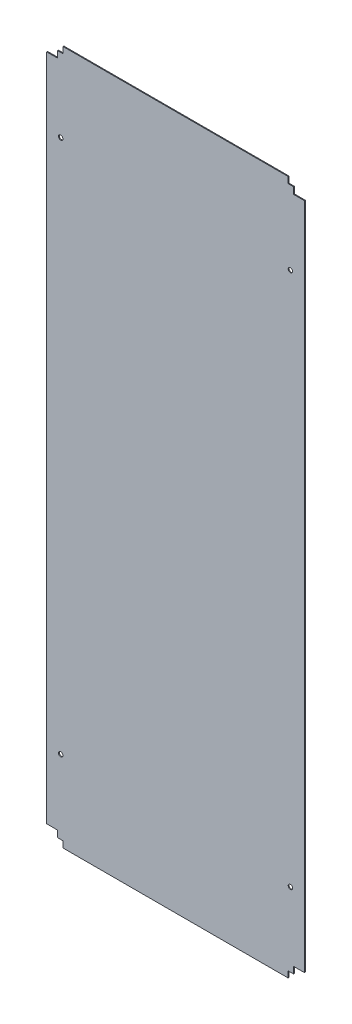
ISO-10303-21;
HEADER;
FILE_DESCRIPTION(('STEP AP214'),'2;1');
FILE_NAME('part.step','',(''),(''),'','','');
FILE_SCHEMA(('AUTOMOTIVE_DESIGN { 1 0 10303 214 1 1 1 1 }'));
ENDSEC;
DATA;
#1=APPLICATION_CONTEXT('core data for automotive mechanical design processes');
#2=APPLICATION_PROTOCOL_DEFINITION('international standard','automotive_design',2000,#1);
#3=PRODUCT_CONTEXT('',#1,'mechanical');
#4=PRODUCT('Part','Part','',(#3));
#5=PRODUCT_RELATED_PRODUCT_CATEGORY('part','',(#4));
#6=PRODUCT_DEFINITION_FORMATION('','',#4);
#7=PRODUCT_DEFINITION_CONTEXT('part definition',#1,'design');
#8=PRODUCT_DEFINITION('design','',#6,#7);
#9=PRODUCT_DEFINITION_SHAPE('','',#8);
#10=(LENGTH_UNIT() NAMED_UNIT(*) SI_UNIT(.MILLI.,.METRE.));
#11=(NAMED_UNIT(*) PLANE_ANGLE_UNIT() SI_UNIT($,.RADIAN.));
#12=(NAMED_UNIT(*) SI_UNIT($,.STERADIAN.) SOLID_ANGLE_UNIT());
#13=UNCERTAINTY_MEASURE_WITH_UNIT(LENGTH_MEASURE(1.E-05),#10,'distance_accuracy_value','');
#14=(GEOMETRIC_REPRESENTATION_CONTEXT(3) GLOBAL_UNCERTAINTY_ASSIGNED_CONTEXT((#13)) GLOBAL_UNIT_ASSIGNED_CONTEXT((#10,
#11,#12)) REPRESENTATION_CONTEXT('',''));
#15=CARTESIAN_POINT('',(0.,0.,0.));
#16=DIRECTION('',(0.,0.,1.));
#17=DIRECTION('',(1.,0.,0.));
#18=AXIS2_PLACEMENT_3D('',#15,#16,#17);
#19=CARTESIAN_POINT('',(0.,0.,-1.524));
#20=DIRECTION('',(0.,0.,1.));
#21=DIRECTION('',(1.,0.,0.));
#22=AXIS2_PLACEMENT_3D('',#19,#20,#21);
#23=PLANE('',#22);
#24=CARTESIAN_POINT('',(-204.851,476.25,-1.524));
#25=DIRECTION('',(0.,0.,1.));
#26=DIRECTION('',(1.,0.,0.));
#27=AXIS2_PLACEMENT_3D('',#24,#25,#26);
#28=CIRCLE('',#27,3.9624);
#29=CARTESIAN_POINT('',(-200.8886,476.25,-1.524));
#30=VERTEX_POINT('',#29);
#31=EDGE_CURVE('E534',#30,#30,#28,.T.);
#32=ORIENTED_EDGE('',*,*,#31,.T.);
#33=EDGE_LOOP('',(#32));
#34=FACE_BOUND('',#33,.T.);
#35=CARTESIAN_POINT('',(-204.851,-476.25,-1.524));
#36=DIRECTION('',(0.,0.,1.));
#37=DIRECTION('',(1.,0.,0.));
#38=AXIS2_PLACEMENT_3D('',#35,#36,#37);
#39=CIRCLE('',#38,3.9624);
#40=CARTESIAN_POINT('',(-200.8886,-476.25,-1.524));
#41=VERTEX_POINT('',#40);
#42=EDGE_CURVE('E530',#41,#41,#39,.T.);
#43=ORIENTED_EDGE('',*,*,#42,.T.);
#44=EDGE_LOOP('',(#43));
#45=FACE_BOUND('',#44,.T.);
#46=CARTESIAN_POINT('',(204.851,-476.25,-1.524));
#47=DIRECTION('',(0.,0.,1.));
#48=DIRECTION('',(1.,0.,0.));
#49=AXIS2_PLACEMENT_3D('',#46,#47,#48);
#50=CIRCLE('',#49,3.9624);
#51=CARTESIAN_POINT('',(208.8134,-476.25,-1.524));
#52=VERTEX_POINT('',#51);
#53=EDGE_CURVE('E526',#52,#52,#50,.T.);
#54=ORIENTED_EDGE('',*,*,#53,.T.);
#55=EDGE_LOOP('',(#54));
#56=FACE_BOUND('',#55,.T.);
#57=CARTESIAN_POINT('',(204.851,476.25,-1.524));
#58=DIRECTION('',(0.,0.,1.));
#59=DIRECTION('',(1.,0.,0.));
#60=AXIS2_PLACEMENT_3D('',#57,#58,#59);
#61=CIRCLE('',#60,3.9624);
#62=CARTESIAN_POINT('',(208.8134,476.25,-1.524));
#63=VERTEX_POINT('',#62);
#64=EDGE_CURVE('E522',#63,#63,#61,.T.);
#65=ORIENTED_EDGE('',*,*,#64,.T.);
#66=EDGE_LOOP('',(#65));
#67=FACE_BOUND('',#66,.T.);
#68=DIRECTION('',(0.,-1.,0.));
#69=VECTOR('',#68,1.);
#70=CARTESIAN_POINT('',(210.439,-600.256893218813,-1.52400000000002));
#71=LINE('',#70,#69);
#72=CARTESIAN_POINT('',(210.439,-607.900214121891,-1.52399999999997));
#73=VERTEX_POINT('',#72);
#74=CARTESIAN_POINT('',(210.439,-596.138,-1.52400000000002));
#75=VERTEX_POINT('',#74);
#76=EDGE_CURVE('E554',#73,#75,#71,.F.);
#77=ORIENTED_EDGE('',*,*,#76,.F.);
#78=DIRECTION('',(1.,0.,0.));
#79=VECTOR('',#78,1.);
#80=CARTESIAN_POINT('',(0.,-607.900214121891,-1.52399999999997));
#81=LINE('',#80,#79);
#82=CARTESIAN_POINT('',(200.787,-607.900214121891,-1.52399999999997));
#83=VERTEX_POINT('',#82);
#84=EDGE_CURVE('E465',#83,#73,#81,.T.);
#85=ORIENTED_EDGE('',*,*,#84,.F.);
#86=DIRECTION('',(0.,1.,0.));
#87=VECTOR('',#86,1.);
#88=CARTESIAN_POINT('',(200.787,-599.911023594988,-1.52399999999997));
#89=LINE('',#88,#87);
#90=CARTESIAN_POINT('',(200.787,-618.961023594992,-1.52399999999975));
#91=VERTEX_POINT('',#90);
#92=EDGE_CURVE('E475',#91,#83,#89,.T.);
#93=ORIENTED_EDGE('',*,*,#92,.F.);
#94=DIRECTION('',(-1.,0.,0.));
#95=VECTOR('',#94,1.);
#96=CARTESIAN_POINT('',(0.,-618.961023594992,-1.52399999999975));
#97=LINE('',#96,#95);
#98=CARTESIAN_POINT('',(-200.787,-618.961023594992,-1.52399999999975));
#99=VERTEX_POINT('',#98);
#100=EDGE_CURVE('E447',#91,#99,#97,.T.);
#101=ORIENTED_EDGE('',*,*,#100,.T.);
#102=DIRECTION('',(0.,-1.,0.));
#103=VECTOR('',#102,1.);
#104=CARTESIAN_POINT('',(-200.787,-599.911023594988,-1.52399999999997));
#105=LINE('',#104,#103);
#106=CARTESIAN_POINT('',(-200.787,-607.785023594985,-1.52399999999986));
#107=VERTEX_POINT('',#106);
#108=EDGE_CURVE('E433',#107,#99,#105,.T.);
#109=ORIENTED_EDGE('',*,*,#108,.F.);
#110=DIRECTION('',(1.,0.,0.));
#111=VECTOR('',#110,1.);
#112=CARTESIAN_POINT('',(0.,-607.785023594985,-1.52399999999997));
#113=LINE('',#112,#111);
#114=CARTESIAN_POINT('',(-210.439,-607.785023594985,-1.52399999999997));
#115=VERTEX_POINT('',#114);
#116=EDGE_CURVE('E458',#115,#107,#113,.T.);
#117=ORIENTED_EDGE('',*,*,#116,.F.);
#118=DIRECTION('',(0.,1.,0.));
#119=VECTOR('',#118,1.);
#120=CARTESIAN_POINT('',(-210.439,0.,-1.524));
#121=LINE('',#120,#119);
#122=CARTESIAN_POINT('',(-210.439,-596.138,-1.52400000000009));
#123=VERTEX_POINT('',#122);
#124=EDGE_CURVE('E518',#115,#123,#121,.T.);
#125=ORIENTED_EDGE('',*,*,#124,.T.);
#126=DIRECTION('',(-1.,0.,0.));
#127=VECTOR('',#126,1.);
#128=CARTESIAN_POINT('',(-212.198511797496,-596.138,-1.52400000000009));
#129=LINE('',#128,#127);
#130=CARTESIAN_POINT('',(-229.960023594992,-596.138,-1.52399999999989));
#131=VERTEX_POINT('',#130);
#132=EDGE_CURVE('E426',#123,#131,#129,.T.);
#133=ORIENTED_EDGE('',*,*,#132,.T.);
#134=DIRECTION('',(0.,1.,0.));
#135=VECTOR('',#134,1.);
#136=CARTESIAN_POINT('',(-229.960023594992,0.,-1.52399999999994));
#137=LINE('',#136,#135);
#138=CARTESIAN_POINT('',(-229.960023594992,596.138,-1.524));
#139=VERTEX_POINT('',#138);
#140=EDGE_CURVE('E419',#131,#139,#137,.T.);
#141=ORIENTED_EDGE('',*,*,#140,.T.);
#142=DIRECTION('',(-1.,0.,0.));
#143=VECTOR('',#142,1.);
#144=CARTESIAN_POINT('',(-212.198511797496,596.138,-1.52400000000009));
#145=LINE('',#144,#143);
#146=CARTESIAN_POINT('',(-210.439,596.138,-1.52400000000009));
#147=VERTEX_POINT('',#146);
#148=EDGE_CURVE('E429',#139,#147,#145,.F.);
#149=ORIENTED_EDGE('',*,*,#148,.T.);
#150=DIRECTION('',(0.,1.,0.));
#151=VECTOR('',#150,1.);
#152=CARTESIAN_POINT('',(-210.439,600.256893218814,-1.52400000000017));
#153=LINE('',#152,#151);
#154=CARTESIAN_POINT('',(-210.439,607.785023594992,-1.52400000000019));
#155=VERTEX_POINT('',#154);
#156=EDGE_CURVE('E538',#155,#147,#153,.F.);
#157=ORIENTED_EDGE('',*,*,#156,.F.);
#158=DIRECTION('',(1.,0.,0.));
#159=VECTOR('',#158,1.);
#160=CARTESIAN_POINT('',(0.,607.785023594992,-1.52400000000019));
#161=LINE('',#160,#159);
#162=CARTESIAN_POINT('',(-200.787,607.785023594992,-1.52400000000019));
#163=VERTEX_POINT('',#162);
#164=EDGE_CURVE('E351',#155,#163,#161,.T.);
#165=ORIENTED_EDGE('',*,*,#164,.T.);
#166=DIRECTION('',(0.,1.,0.));
#167=VECTOR('',#166,1.);
#168=CARTESIAN_POINT('',(-200.787,599.911023594988,-1.52400000000019));
#169=LINE('',#168,#167);
#170=CARTESIAN_POINT('',(-200.787,618.961023594992,-1.52399999999997));
#171=VERTEX_POINT('',#170);
#172=EDGE_CURVE('E342',#163,#171,#169,.T.);
#173=ORIENTED_EDGE('',*,*,#172,.T.);
#174=DIRECTION('',(-1.,0.,0.));
#175=VECTOR('',#174,1.);
#176=CARTESIAN_POINT('',(0.,618.961023594992,-1.52399999999997));
#177=LINE('',#176,#175);
#178=CARTESIAN_POINT('',(200.787,618.961023594992,-1.52399999999997));
#179=VERTEX_POINT('',#178);
#180=EDGE_CURVE('E334',#171,#179,#177,.F.);
#181=ORIENTED_EDGE('',*,*,#180,.T.);
#182=DIRECTION('',(0.,-1.,0.));
#183=VECTOR('',#182,1.);
#184=CARTESIAN_POINT('',(200.787,599.911023594988,-1.52400000000019));
#185=LINE('',#184,#183);
#186=CARTESIAN_POINT('',(200.787,607.900214121898,-1.52400000000008));
#187=VERTEX_POINT('',#186);
#188=EDGE_CURVE('E315',#179,#187,#185,.T.);
#189=ORIENTED_EDGE('',*,*,#188,.T.);
#190=DIRECTION('',(1.,0.,0.));
#191=VECTOR('',#190,1.);
#192=CARTESIAN_POINT('',(0.,607.900214121898,-1.52400000000019));
#193=LINE('',#192,#191);
#194=CARTESIAN_POINT('',(210.439,607.900214121898,-1.52400000000019));
#195=VERTEX_POINT('',#194);
#196=EDGE_CURVE('E326',#187,#195,#193,.T.);
#197=ORIENTED_EDGE('',*,*,#196,.T.);
#198=CARTESIAN_POINT('',(210.439,596.138,-1.52400000000002));
#199=VERTEX_POINT('',#198);
#200=EDGE_CURVE('E552',#199,#195,#71,.F.);
#201=ORIENTED_EDGE('',*,*,#200,.F.);
#202=DIRECTION('',(-1.,0.,0.));
#203=VECTOR('',#202,1.);
#204=CARTESIAN_POINT('',(212.198511797496,596.138,-1.52400000000002));
#205=LINE('',#204,#203);
#206=CARTESIAN_POINT('',(229.960023594992,596.138,-1.52399999999991));
#207=VERTEX_POINT('',#206);
#208=EDGE_CURVE('E399',#199,#207,#205,.F.);
#209=ORIENTED_EDGE('',*,*,#208,.T.);
#210=DIRECTION('',(0.,-1.,0.));
#211=VECTOR('',#210,1.);
#212=CARTESIAN_POINT('',(229.960023594992,0.,-1.52399999999986));
#213=LINE('',#212,#211);
#214=CARTESIAN_POINT('',(229.960023594992,-596.138,-1.52399999999991));
#215=VERTEX_POINT('',#214);
#216=EDGE_CURVE('E392',#207,#215,#213,.T.);
#217=ORIENTED_EDGE('',*,*,#216,.T.);
#218=DIRECTION('',(-1.,0.,0.));
#219=VECTOR('',#218,1.);
#220=CARTESIAN_POINT('',(212.198511797496,-596.138,-1.52400000000002));
#221=LINE('',#220,#219);
#222=EDGE_CURVE('E402',#215,#75,#221,.T.);
#223=ORIENTED_EDGE('',*,*,#222,.T.);
#224=EDGE_LOOP('',(#77,#85,#93,#101,#109,#117,#125,#133,#141,#149,#157,#165,#173,#181,#189,#197,
#201,#209,#217,#223));
#225=FACE_BOUND('',#224,.T.);
#226=ADVANCED_FACE('F175',(#34,#45,#56,#67,#225),#23,.F.);
#227=CARTESIAN_POINT('',(0.,0.,0.));
#228=DIRECTION('',(0.,0.,1.));
#229=DIRECTION('',(1.,0.,0.));
#230=AXIS2_PLACEMENT_3D('',#227,#228,#229);
#231=PLANE('',#230);
#232=CARTESIAN_POINT('',(-204.851,476.25,0.));
#233=DIRECTION('',(0.,0.,1.));
#234=DIRECTION('',(1.,0.,0.));
#235=AXIS2_PLACEMENT_3D('',#232,#233,#234);
#236=CIRCLE('',#235,3.9624);
#237=CARTESIAN_POINT('',(-200.8886,476.25,0.));
#238=VERTEX_POINT('',#237);
#239=EDGE_CURVE('E499',#238,#238,#236,.T.);
#240=ORIENTED_EDGE('',*,*,#239,.F.);
#241=EDGE_LOOP('',(#240));
#242=FACE_BOUND('',#241,.T.);
#243=CARTESIAN_POINT('',(-204.851,-476.25,0.));
#244=DIRECTION('',(0.,0.,1.));
#245=DIRECTION('',(1.,0.,0.));
#246=AXIS2_PLACEMENT_3D('',#243,#244,#245);
#247=CIRCLE('',#246,3.9624);
#248=CARTESIAN_POINT('',(-200.8886,-476.25,0.));
#249=VERTEX_POINT('',#248);
#250=EDGE_CURVE('E504',#249,#249,#247,.T.);
#251=ORIENTED_EDGE('',*,*,#250,.F.);
#252=EDGE_LOOP('',(#251));
#253=FACE_BOUND('',#252,.T.);
#254=CARTESIAN_POINT('',(204.851,-476.25,0.));
#255=DIRECTION('',(0.,0.,1.));
#256=DIRECTION('',(1.,0.,0.));
#257=AXIS2_PLACEMENT_3D('',#254,#255,#256);
#258=CIRCLE('',#257,3.9624);
#259=CARTESIAN_POINT('',(208.8134,-476.25,0.));
#260=VERTEX_POINT('',#259);
#261=EDGE_CURVE('E508',#260,#260,#258,.T.);
#262=ORIENTED_EDGE('',*,*,#261,.F.);
#263=EDGE_LOOP('',(#262));
#264=FACE_BOUND('',#263,.T.);
#265=CARTESIAN_POINT('',(204.851,476.25,0.));
#266=DIRECTION('',(0.,0.,1.));
#267=DIRECTION('',(1.,0.,0.));
#268=AXIS2_PLACEMENT_3D('',#265,#266,#267);
#269=CIRCLE('',#268,3.9624);
#270=CARTESIAN_POINT('',(208.8134,476.25,0.));
#271=VERTEX_POINT('',#270);
#272=EDGE_CURVE('E503',#271,#271,#269,.T.);
#273=ORIENTED_EDGE('',*,*,#272,.F.);
#274=EDGE_LOOP('',(#273));
#275=FACE_BOUND('',#274,.T.);
#276=DIRECTION('',(0.,1.,0.));
#277=VECTOR('',#276,1.);
#278=CARTESIAN_POINT('',(-210.439,600.256893218814,-1.73038666728687E-13));
#279=LINE('',#278,#277);
#280=CARTESIAN_POINT('',(-210.439,607.785023594992,-2.22044604925031E-13));
#281=VERTEX_POINT('',#280);
#282=CARTESIAN_POINT('',(-210.439,596.138,0.));
#283=VERTEX_POINT('',#282);
#284=EDGE_CURVE('E549',#281,#283,#279,.F.);
#285=ORIENTED_EDGE('',*,*,#284,.T.);
#286=DIRECTION('',(-1.,0.,0.));
#287=VECTOR('',#286,1.);
#288=CARTESIAN_POINT('',(-212.198511797496,596.138,0.));
#289=LINE('',#288,#287);
#290=CARTESIAN_POINT('',(-229.960023594992,596.138,0.));
#291=VERTEX_POINT('',#290);
#292=EDGE_CURVE('E201',#291,#283,#289,.F.);
#293=ORIENTED_EDGE('',*,*,#292,.F.);
#294=DIRECTION('',(0.,-1.,0.));
#295=VECTOR('',#294,1.);
#296=CARTESIAN_POINT('',(-229.960023594992,-602.488,1.11022302462516E-13));
#297=LINE('',#296,#295);
#298=CARTESIAN_POINT('',(-229.960023594992,-596.138,1.11022302462516E-13));
#299=VERTEX_POINT('',#298);
#300=EDGE_CURVE('E406',#299,#291,#297,.F.);
#301=ORIENTED_EDGE('',*,*,#300,.F.);
#302=DIRECTION('',(-1.,0.,0.));
#303=VECTOR('',#302,1.);
#304=CARTESIAN_POINT('',(-212.198511797496,-596.138,0.));
#305=LINE('',#304,#303);
#306=CARTESIAN_POINT('',(-210.439,-596.138,0.));
#307=VERTEX_POINT('',#306);
#308=EDGE_CURVE('E414',#307,#299,#305,.T.);
#309=ORIENTED_EDGE('',*,*,#308,.F.);
#310=DIRECTION('',(0.,1.,0.));
#311=VECTOR('',#310,1.);
#312=CARTESIAN_POINT('',(-210.439,-596.138,0.));
#313=LINE('',#312,#311);
#314=CARTESIAN_POINT('',(-210.439,-607.785023594985,0.));
#315=VERTEX_POINT('',#314);
#316=EDGE_CURVE('E442',#315,#307,#313,.T.);
#317=ORIENTED_EDGE('',*,*,#316,.F.);
#318=DIRECTION('',(-1.,0.,0.));
#319=VECTOR('',#318,1.);
#320=CARTESIAN_POINT('',(-210.439,-607.785023594985,0.));
#321=LINE('',#320,#319);
#322=CARTESIAN_POINT('',(-200.787,-607.785023594985,0.));
#323=VERTEX_POINT('',#322);
#324=EDGE_CURVE('E451',#323,#315,#321,.T.);
#325=ORIENTED_EDGE('',*,*,#324,.F.);
#326=DIRECTION('',(0.,1.,0.));
#327=VECTOR('',#326,1.);
#328=CARTESIAN_POINT('',(-200.787,-607.785023594985,0.));
#329=LINE('',#328,#327);
#330=CARTESIAN_POINT('',(-200.787,-618.961023594992,2.22044604925031E-13));
#331=VERTEX_POINT('',#330);
#332=EDGE_CURVE('E486',#331,#323,#329,.T.);
#333=ORIENTED_EDGE('',*,*,#332,.F.);
#334=DIRECTION('',(1.,0.,0.));
#335=VECTOR('',#334,1.);
#336=CARTESIAN_POINT('',(213.487,-618.961023594992,2.22044604925031E-13));
#337=LINE('',#336,#335);
#338=CARTESIAN_POINT('',(200.787,-618.961023594992,2.22044604925031E-13));
#339=VERTEX_POINT('',#338);
#340=EDGE_CURVE('E478',#339,#331,#337,.F.);
#341=ORIENTED_EDGE('',*,*,#340,.F.);
#342=DIRECTION('',(0.,-1.,0.));
#343=VECTOR('',#342,1.);
#344=CARTESIAN_POINT('',(200.787,-607.900214121891,0.));
#345=LINE('',#344,#343);
#346=CARTESIAN_POINT('',(200.787,-607.900214121891,0.));
#347=VERTEX_POINT('',#346);
#348=EDGE_CURVE('E469',#347,#339,#345,.T.);
#349=ORIENTED_EDGE('',*,*,#348,.F.);
#350=DIRECTION('',(-1.,0.,0.));
#351=VECTOR('',#350,1.);
#352=CARTESIAN_POINT('',(210.439,-607.900214121891,0.));
#353=LINE('',#352,#351);
#354=CARTESIAN_POINT('',(210.439,-607.900214121891,0.));
#355=VERTEX_POINT('',#354);
#356=EDGE_CURVE('E461',#355,#347,#353,.T.);
#357=ORIENTED_EDGE('',*,*,#356,.F.);
#358=DIRECTION('',(0.,-1.,0.));
#359=VECTOR('',#358,1.);
#360=CARTESIAN_POINT('',(210.439,-600.256893218813,0.));
#361=LINE('',#360,#359);
#362=CARTESIAN_POINT('',(210.439,-596.138,0.));
#363=VERTEX_POINT('',#362);
#364=EDGE_CURVE('E179',#355,#363,#361,.F.);
#365=ORIENTED_EDGE('',*,*,#364,.T.);
#366=DIRECTION('',(-1.,0.,0.));
#367=VECTOR('',#366,1.);
#368=CARTESIAN_POINT('',(212.198511797496,-596.138,0.));
#369=LINE('',#368,#367);
#370=CARTESIAN_POINT('',(229.960023594992,-596.138,1.38777878078145E-13));
#371=VERTEX_POINT('',#370);
#372=EDGE_CURVE('E193',#371,#363,#369,.T.);
#373=ORIENTED_EDGE('',*,*,#372,.F.);
#374=DIRECTION('',(0.,1.,0.));
#375=VECTOR('',#374,1.);
#376=CARTESIAN_POINT('',(229.960023594992,602.488,0.));
#377=LINE('',#376,#375);
#378=CARTESIAN_POINT('',(229.960023594992,596.138,0.));
#379=VERTEX_POINT('',#378);
#380=EDGE_CURVE('E349',#379,#371,#377,.F.);
#381=ORIENTED_EDGE('',*,*,#380,.F.);
#382=DIRECTION('',(-1.,0.,0.));
#383=VECTOR('',#382,1.);
#384=CARTESIAN_POINT('',(212.198511797496,596.138,0.));
#385=LINE('',#384,#383);
#386=CARTESIAN_POINT('',(210.439,596.138,0.));
#387=VERTEX_POINT('',#386);
#388=EDGE_CURVE('E387',#387,#379,#385,.F.);
#389=ORIENTED_EDGE('',*,*,#388,.F.);
#390=DIRECTION('',(0.,-1.,0.));
#391=VECTOR('',#390,1.);
#392=CARTESIAN_POINT('',(210.439,602.488,0.));
#393=LINE('',#392,#391);
#394=CARTESIAN_POINT('',(210.439,607.900214121898,-2.22044604925031E-13));
#395=VERTEX_POINT('',#394);
#396=EDGE_CURVE('E498',#395,#387,#393,.T.);
#397=ORIENTED_EDGE('',*,*,#396,.F.);
#398=DIRECTION('',(1.,0.,0.));
#399=VECTOR('',#398,1.);
#400=CARTESIAN_POINT('',(200.787,607.900214121898,-2.22044604925031E-13));
#401=LINE('',#400,#399);
#402=CARTESIAN_POINT('',(200.787,607.900214121898,-2.22044604925031E-13));
#403=VERTEX_POINT('',#402);
#404=EDGE_CURVE('E338',#403,#395,#401,.T.);
#405=ORIENTED_EDGE('',*,*,#404,.F.);
#406=DIRECTION('',(0.,-1.,0.));
#407=VECTOR('',#406,1.);
#408=CARTESIAN_POINT('',(200.787,618.961023594992,0.));
#409=LINE('',#408,#407);
#410=CARTESIAN_POINT('',(200.787,618.961023594992,0.));
#411=VERTEX_POINT('',#410);
#412=EDGE_CURVE('E327',#411,#403,#409,.T.);
#413=ORIENTED_EDGE('',*,*,#412,.F.);
#414=DIRECTION('',(1.,0.,0.));
#415=VECTOR('',#414,1.);
#416=CARTESIAN_POINT('',(213.487,618.961023594992,0.));
#417=LINE('',#416,#415);
#418=CARTESIAN_POINT('',(-200.787,618.961023594992,0.));
#419=VERTEX_POINT('',#418);
#420=EDGE_CURVE('E336',#419,#411,#417,.T.);
#421=ORIENTED_EDGE('',*,*,#420,.F.);
#422=DIRECTION('',(0.,1.,0.));
#423=VECTOR('',#422,1.);
#424=CARTESIAN_POINT('',(-200.787,607.785023594992,-2.22044604925031E-13));
#425=LINE('',#424,#423);
#426=CARTESIAN_POINT('',(-200.787,607.785023594992,-2.22044604925031E-13));
#427=VERTEX_POINT('',#426);
#428=EDGE_CURVE('E376',#427,#419,#425,.T.);
#429=ORIENTED_EDGE('',*,*,#428,.F.);
#430=DIRECTION('',(1.,0.,0.));
#431=VECTOR('',#430,1.);
#432=CARTESIAN_POINT('',(-210.439,607.785023594992,-2.22044604925031E-13));
#433=LINE('',#432,#431);
#434=EDGE_CURVE('E365',#281,#427,#433,.T.);
#435=ORIENTED_EDGE('',*,*,#434,.F.);
#436=EDGE_LOOP('',(#285,#293,#301,#309,#317,#325,#333,#341,#349,#357,#365,#373,#381,#389,#397,
#405,#413,#421,#429,#435));
#437=FACE_BOUND('',#436,.T.);
#438=ADVANCED_FACE('F177',(#242,#253,#264,#275,#437),#231,.T.);
#439=CARTESIAN_POINT('',(210.439,-596.138,-75.438));
#440=DIRECTION('',(-1.,0.,0.));
#441=DIRECTION('',(0.,0.,1.));
#442=AXIS2_PLACEMENT_3D('',#439,#440,#441);
#443=PLANE('',#442);
#444=ORIENTED_EDGE('',*,*,#364,.F.);
#445=DIRECTION('',(0.,0.,-1.));
#446=VECTOR('',#445,1.);
#447=CARTESIAN_POINT('',(210.439,-607.900214121891,-6.35000000000041));
#448=LINE('',#447,#446);
#449=EDGE_CURVE('E443',#355,#73,#448,.T.);
#450=ORIENTED_EDGE('',*,*,#449,.T.);
#451=ORIENTED_EDGE('',*,*,#76,.T.);
#452=DIRECTION('',(0.,0.,1.));
#453=VECTOR('',#452,1.);
#454=CARTESIAN_POINT('',(210.439,-596.138,-75.438));
#455=LINE('',#454,#453);
#456=EDGE_CURVE('E13',#75,#363,#455,.T.);
#457=ORIENTED_EDGE('',*,*,#456,.T.);
#458=EDGE_LOOP('',(#444,#450,#451,#457));
#459=FACE_BOUND('',#458,.T.);
#460=ADVANCED_FACE('F580',(#459),#443,.F.);
#461=CARTESIAN_POINT('',(-210.439,-596.138,-75.438));
#462=DIRECTION('',(1.,0.,0.));
#463=DIRECTION('',(0.,0.,-1.));
#464=AXIS2_PLACEMENT_3D('',#461,#462,#463);
#465=PLANE('',#464);
#466=ORIENTED_EDGE('',*,*,#124,.F.);
#467=DIRECTION('',(0.,0.,1.));
#468=VECTOR('',#467,1.);
#469=CARTESIAN_POINT('',(-210.439,-607.785023594985,-38.1));
#470=LINE('',#469,#468);
#471=EDGE_CURVE('E438',#115,#315,#470,.T.);
#472=ORIENTED_EDGE('',*,*,#471,.T.);
#473=ORIENTED_EDGE('',*,*,#316,.T.);
#474=DIRECTION('',(0.,0.,1.));
#475=VECTOR('',#474,1.);
#476=CARTESIAN_POINT('',(-210.439,-596.138,-75.438));
#477=LINE('',#476,#475);
#478=EDGE_CURVE('E539',#123,#307,#477,.T.);
#479=ORIENTED_EDGE('',*,*,#478,.F.);
#480=EDGE_LOOP('',(#466,#472,#473,#479));
#481=FACE_BOUND('',#480,.T.);
#482=ADVANCED_FACE('F606',(#481),#465,.F.);
#483=CARTESIAN_POINT('',(-210.439,602.488,-75.438));
#484=DIRECTION('',(1.,0.,0.));
#485=DIRECTION('',(0.,0.,-1.));
#486=AXIS2_PLACEMENT_3D('',#483,#484,#485);
#487=PLANE('',#486);
#488=ORIENTED_EDGE('',*,*,#284,.F.);
#489=DIRECTION('',(0.,0.,1.));
#490=VECTOR('',#489,1.);
#491=CARTESIAN_POINT('',(-210.439,607.785023594992,-11.1760000000002));
#492=LINE('',#491,#490);
#493=EDGE_CURVE('E369',#155,#281,#492,.T.);
#494=ORIENTED_EDGE('',*,*,#493,.F.);
#495=ORIENTED_EDGE('',*,*,#156,.T.);
#496=DIRECTION('',(0.,0.,1.));
#497=VECTOR('',#496,1.);
#498=CARTESIAN_POINT('',(-210.439,596.138,-75.438));
#499=LINE('',#498,#497);
#500=EDGE_CURVE('E542',#147,#283,#499,.T.);
#501=ORIENTED_EDGE('',*,*,#500,.T.);
#502=EDGE_LOOP('',(#488,#494,#495,#501));
#503=FACE_BOUND('',#502,.T.);
#504=ADVANCED_FACE('F621',(#503),#487,.F.);
#505=CARTESIAN_POINT('',(210.439,602.488,-75.438));
#506=DIRECTION('',(-1.,0.,0.));
#507=DIRECTION('',(0.,0.,1.));
#508=AXIS2_PLACEMENT_3D('',#505,#506,#507);
#509=PLANE('',#508);
#510=ORIENTED_EDGE('',*,*,#200,.T.);
#511=DIRECTION('',(0.,0.,1.));
#512=VECTOR('',#511,1.);
#513=CARTESIAN_POINT('',(210.439,607.900214121898,-11.1760000000002));
#514=LINE('',#513,#512);
#515=EDGE_CURVE('E344',#195,#395,#514,.T.);
#516=ORIENTED_EDGE('',*,*,#515,.T.);
#517=ORIENTED_EDGE('',*,*,#396,.T.);
#518=DIRECTION('',(0.,0.,1.));
#519=VECTOR('',#518,1.);
#520=CARTESIAN_POINT('',(210.439,596.138,-75.438));
#521=LINE('',#520,#519);
#522=EDGE_CURVE('E185',#199,#387,#521,.T.);
#523=ORIENTED_EDGE('',*,*,#522,.F.);
#524=EDGE_LOOP('',(#510,#516,#517,#523));
#525=FACE_BOUND('',#524,.T.);
#526=ADVANCED_FACE('F564',(#525),#509,.F.);
#527=CARTESIAN_POINT('',(204.851,476.25,-75.438));
#528=DIRECTION('',(0.,0.,1.));
#529=DIRECTION('',(1.,0.,0.));
#530=AXIS2_PLACEMENT_3D('',#527,#528,#529);
#531=CYLINDRICAL_SURFACE('',#530,3.9624);
#532=ORIENTED_EDGE('',*,*,#272,.T.);
#533=EDGE_LOOP('',(#532));
#534=FACE_BOUND('',#533,.T.);
#535=ORIENTED_EDGE('',*,*,#64,.F.);
#536=EDGE_LOOP('',(#535));
#537=FACE_BOUND('',#536,.T.);
#538=ADVANCED_FACE('F647',(#534,#537),#531,.F.);
#539=CARTESIAN_POINT('',(204.851,-476.25,-75.438));
#540=DIRECTION('',(0.,0.,1.));
#541=DIRECTION('',(1.,0.,0.));
#542=AXIS2_PLACEMENT_3D('',#539,#540,#541);
#543=CYLINDRICAL_SURFACE('',#542,3.9624);
#544=ORIENTED_EDGE('',*,*,#261,.T.);
#545=EDGE_LOOP('',(#544));
#546=FACE_BOUND('',#545,.T.);
#547=ORIENTED_EDGE('',*,*,#53,.F.);
#548=EDGE_LOOP('',(#547));
#549=FACE_BOUND('',#548,.T.);
#550=ADVANCED_FACE('F658',(#546,#549),#543,.F.);
#551=CARTESIAN_POINT('',(-204.851,-476.25,-75.438));
#552=DIRECTION('',(0.,0.,1.));
#553=DIRECTION('',(1.,0.,0.));
#554=AXIS2_PLACEMENT_3D('',#551,#552,#553);
#555=CYLINDRICAL_SURFACE('',#554,3.9624);
#556=ORIENTED_EDGE('',*,*,#250,.T.);
#557=EDGE_LOOP('',(#556));
#558=FACE_BOUND('',#557,.T.);
#559=ORIENTED_EDGE('',*,*,#42,.F.);
#560=EDGE_LOOP('',(#559));
#561=FACE_BOUND('',#560,.T.);
#562=ADVANCED_FACE('F663',(#558,#561),#555,.F.);
#563=CARTESIAN_POINT('',(-204.851,476.25,-75.438));
#564=DIRECTION('',(0.,0.,1.));
#565=DIRECTION('',(1.,0.,0.));
#566=AXIS2_PLACEMENT_3D('',#563,#564,#565);
#567=CYLINDRICAL_SURFACE('',#566,3.9624);
#568=ORIENTED_EDGE('',*,*,#239,.T.);
#569=EDGE_LOOP('',(#568));
#570=FACE_BOUND('',#569,.T.);
#571=ORIENTED_EDGE('',*,*,#31,.F.);
#572=EDGE_LOOP('',(#571));
#573=FACE_BOUND('',#572,.T.);
#574=ADVANCED_FACE('F673',(#570,#573),#567,.F.);
#575=CARTESIAN_POINT('',(-200.787,-607.785023594985,-38.1));
#576=DIRECTION('',(1.,0.,0.));
#577=DIRECTION('',(0.,-1.,0.));
#578=AXIS2_PLACEMENT_3D('',#575,#576,#577);
#579=PLANE('',#578);
#580=ORIENTED_EDGE('',*,*,#108,.T.);
#581=DIRECTION('',(0.,0.,1.));
#582=VECTOR('',#581,1.);
#583=CARTESIAN_POINT('',(-200.787,-618.961023594992,2.22044604925031E-13));
#584=LINE('',#583,#582);
#585=EDGE_CURVE('E490',#99,#331,#584,.T.);
#586=ORIENTED_EDGE('',*,*,#585,.T.);
#587=ORIENTED_EDGE('',*,*,#332,.T.);
#588=DIRECTION('',(0.,0.,1.));
#589=VECTOR('',#588,1.);
#590=CARTESIAN_POINT('',(-200.787,-607.785023594985,-38.1));
#591=LINE('',#590,#589);
#592=EDGE_CURVE('E455',#107,#323,#591,.T.);
#593=ORIENTED_EDGE('',*,*,#592,.F.);
#594=EDGE_LOOP('',(#580,#586,#587,#593));
#595=FACE_BOUND('',#594,.T.);
#596=ADVANCED_FACE('F600',(#595),#579,.F.);
#597=CARTESIAN_POINT('',(213.487,-618.961023594992,2.22044604925031E-13));
#598=DIRECTION('',(0.,-1.,0.));
#599=DIRECTION('',(0.,0.,-1.));
#600=AXIS2_PLACEMENT_3D('',#597,#598,#599);
#601=PLANE('',#600);
#602=ORIENTED_EDGE('',*,*,#585,.F.);
#603=ORIENTED_EDGE('',*,*,#100,.F.);
#604=DIRECTION('',(0.,0.,1.));
#605=VECTOR('',#604,1.);
#606=CARTESIAN_POINT('',(200.787,-618.961023594993,-38.0999999999998));
#607=LINE('',#606,#605);
#608=EDGE_CURVE('E482',#91,#339,#607,.T.);
#609=ORIENTED_EDGE('',*,*,#608,.T.);
#610=ORIENTED_EDGE('',*,*,#340,.T.);
#611=EDGE_LOOP('',(#602,#603,#609,#610));
#612=FACE_BOUND('',#611,.T.);
#613=ADVANCED_FACE('F595',(#612),#601,.T.);
#614=CARTESIAN_POINT('',(200.787,-607.900214121891,-38.1));
#615=DIRECTION('',(-1.,0.,0.));
#616=DIRECTION('',(0.,1.,0.));
#617=AXIS2_PLACEMENT_3D('',#614,#615,#616);
#618=PLANE('',#617);
#619=ORIENTED_EDGE('',*,*,#92,.T.);
#620=DIRECTION('',(0.,0.,1.));
#621=VECTOR('',#620,1.);
#622=CARTESIAN_POINT('',(200.787,-607.900214121891,-38.1));
#623=LINE('',#622,#621);
#624=EDGE_CURVE('E472',#83,#347,#623,.T.);
#625=ORIENTED_EDGE('',*,*,#624,.T.);
#626=ORIENTED_EDGE('',*,*,#348,.T.);
#627=ORIENTED_EDGE('',*,*,#608,.F.);
#628=EDGE_LOOP('',(#619,#625,#626,#627));
#629=FACE_BOUND('',#628,.T.);
#630=ADVANCED_FACE('F590',(#629),#618,.F.);
#631=CARTESIAN_POINT('',(210.439,-607.900214121891,-38.1));
#632=DIRECTION('',(0.,1.,0.));
#633=DIRECTION('',(0.,0.,1.));
#634=AXIS2_PLACEMENT_3D('',#631,#632,#633);
#635=PLANE('',#634);
#636=ORIENTED_EDGE('',*,*,#84,.T.);
#637=ORIENTED_EDGE('',*,*,#449,.F.);
#638=ORIENTED_EDGE('',*,*,#356,.T.);
#639=ORIENTED_EDGE('',*,*,#624,.F.);
#640=EDGE_LOOP('',(#636,#637,#638,#639));
#641=FACE_BOUND('',#640,.T.);
#642=ADVANCED_FACE('F584',(#641),#635,.F.);
#643=CARTESIAN_POINT('',(-210.439,-607.785023594985,-38.1));
#644=DIRECTION('',(0.,1.,0.));
#645=DIRECTION('',(0.,0.,1.));
#646=AXIS2_PLACEMENT_3D('',#643,#644,#645);
#647=PLANE('',#646);
#648=ORIENTED_EDGE('',*,*,#116,.T.);
#649=ORIENTED_EDGE('',*,*,#592,.T.);
#650=ORIENTED_EDGE('',*,*,#324,.T.);
#651=ORIENTED_EDGE('',*,*,#471,.F.);
#652=EDGE_LOOP('',(#648,#649,#650,#651));
#653=FACE_BOUND('',#652,.T.);
#654=ADVANCED_FACE('F603',(#653),#647,.F.);
#655=CARTESIAN_POINT('',(-212.198511797496,-596.138,-0.807720000000088));
#656=DIRECTION('',(0.,-1.,0.));
#657=DIRECTION('',(-1.,0.,0.));
#658=AXIS2_PLACEMENT_3D('',#655,#656,#657);
#659=PLANE('',#658);
#660=ORIENTED_EDGE('',*,*,#478,.T.);
#661=ORIENTED_EDGE('',*,*,#308,.T.);
#662=DIRECTION('',(0.,0.,-1.));
#663=VECTOR('',#662,1.);
#664=CARTESIAN_POINT('',(-229.960023594992,-596.138,1.11022302462516E-13));
#665=LINE('',#664,#663);
#666=EDGE_CURVE('E415',#299,#131,#665,.T.);
#667=ORIENTED_EDGE('',*,*,#666,.T.);
#668=ORIENTED_EDGE('',*,*,#132,.F.);
#669=EDGE_LOOP('',(#660,#661,#667,#668));
#670=FACE_BOUND('',#669,.T.);
#671=ADVANCED_FACE('F611',(#670),#659,.T.);
#672=CARTESIAN_POINT('',(-212.198511797496,596.138,-0.807720000000088));
#673=DIRECTION('',(0.,-1.,0.));
#674=DIRECTION('',(-1.,0.,0.));
#675=AXIS2_PLACEMENT_3D('',#672,#673,#674);
#676=PLANE('',#675);
#677=ORIENTED_EDGE('',*,*,#292,.T.);
#678=ORIENTED_EDGE('',*,*,#500,.F.);
#679=ORIENTED_EDGE('',*,*,#148,.F.);
#680=DIRECTION('',(0.,0.,1.));
#681=VECTOR('',#680,1.);
#682=CARTESIAN_POINT('',(-229.960023594992,596.138,0.));
#683=LINE('',#682,#681);
#684=EDGE_CURVE('E411',#139,#291,#683,.T.);
#685=ORIENTED_EDGE('',*,*,#684,.T.);
#686=EDGE_LOOP('',(#677,#678,#679,#685));
#687=FACE_BOUND('',#686,.T.);
#688=ADVANCED_FACE('F617',(#687),#676,.F.);
#689=CARTESIAN_POINT('',(-229.960023594992,-602.488,1.11022302462516E-13));
#690=DIRECTION('',(-1.,0.,0.));
#691=DIRECTION('',(0.,0.,1.));
#692=AXIS2_PLACEMENT_3D('',#689,#690,#691);
#693=PLANE('',#692);
#694=ORIENTED_EDGE('',*,*,#684,.F.);
#695=ORIENTED_EDGE('',*,*,#140,.F.);
#696=ORIENTED_EDGE('',*,*,#666,.F.);
#697=ORIENTED_EDGE('',*,*,#300,.T.);
#698=EDGE_LOOP('',(#694,#695,#696,#697));
#699=FACE_BOUND('',#698,.T.);
#700=ADVANCED_FACE('F616',(#699),#693,.T.);
#701=CARTESIAN_POINT('',(212.198511797496,596.138,-0.807720000000016));
#702=DIRECTION('',(0.,-1.,0.));
#703=DIRECTION('',(-1.,0.,0.));
#704=AXIS2_PLACEMENT_3D('',#701,#702,#703);
#705=PLANE('',#704);
#706=ORIENTED_EDGE('',*,*,#522,.T.);
#707=ORIENTED_EDGE('',*,*,#388,.T.);
#708=DIRECTION('',(0.,0.,-1.));
#709=VECTOR('',#708,1.);
#710=CARTESIAN_POINT('',(229.960023594992,596.138,0.));
#711=LINE('',#710,#709);
#712=EDGE_CURVE('E388',#379,#207,#711,.T.);
#713=ORIENTED_EDGE('',*,*,#712,.T.);
#714=ORIENTED_EDGE('',*,*,#208,.F.);
#715=EDGE_LOOP('',(#706,#707,#713,#714));
#716=FACE_BOUND('',#715,.T.);
#717=ADVANCED_FACE('F573',(#716),#705,.F.);
#718=CARTESIAN_POINT('',(212.198511797496,-596.138,-0.807720000000016));
#719=DIRECTION('',(0.,-1.,0.));
#720=DIRECTION('',(-1.,0.,0.));
#721=AXIS2_PLACEMENT_3D('',#718,#719,#720);
#722=PLANE('',#721);
#723=ORIENTED_EDGE('',*,*,#372,.T.);
#724=ORIENTED_EDGE('',*,*,#456,.F.);
#725=ORIENTED_EDGE('',*,*,#222,.F.);
#726=DIRECTION('',(0.,0.,1.));
#727=VECTOR('',#726,1.);
#728=CARTESIAN_POINT('',(229.960023594992,-596.138,0.));
#729=LINE('',#728,#727);
#730=EDGE_CURVE('E384',#215,#371,#729,.T.);
#731=ORIENTED_EDGE('',*,*,#730,.T.);
#732=EDGE_LOOP('',(#723,#724,#725,#731));
#733=FACE_BOUND('',#732,.T.);
#734=ADVANCED_FACE('F579',(#733),#722,.T.);
#735=CARTESIAN_POINT('',(229.960023594992,602.488,0.));
#736=DIRECTION('',(1.,0.,0.));
#737=DIRECTION('',(0.,0.,-1.));
#738=AXIS2_PLACEMENT_3D('',#735,#736,#737);
#739=PLANE('',#738);
#740=ORIENTED_EDGE('',*,*,#712,.F.);
#741=ORIENTED_EDGE('',*,*,#380,.T.);
#742=ORIENTED_EDGE('',*,*,#730,.F.);
#743=ORIENTED_EDGE('',*,*,#216,.F.);
#744=EDGE_LOOP('',(#740,#741,#742,#743));
#745=FACE_BOUND('',#744,.T.);
#746=ADVANCED_FACE('F576',(#745),#739,.T.);
#747=CARTESIAN_POINT('',(213.487,618.961023594992,0.));
#748=DIRECTION('',(0.,1.,0.));
#749=DIRECTION('',(0.,0.,1.));
#750=AXIS2_PLACEMENT_3D('',#747,#748,#749);
#751=PLANE('',#750);
#752=DIRECTION('',(0.,0.,1.));
#753=VECTOR('',#752,1.);
#754=CARTESIAN_POINT('',(200.787,618.961023594992,0.));
#755=LINE('',#754,#753);
#756=EDGE_CURVE('E319',#179,#411,#755,.T.);
#757=ORIENTED_EDGE('',*,*,#756,.F.);
#758=ORIENTED_EDGE('',*,*,#180,.F.);
#759=DIRECTION('',(0.,0.,-1.));
#760=VECTOR('',#759,1.);
#761=CARTESIAN_POINT('',(-200.787,618.961023594992,0.));
#762=LINE('',#761,#760);
#763=EDGE_CURVE('E373',#419,#171,#762,.T.);
#764=ORIENTED_EDGE('',*,*,#763,.F.);
#765=ORIENTED_EDGE('',*,*,#420,.T.);
#766=EDGE_LOOP('',(#757,#758,#764,#765));
#767=FACE_BOUND('',#766,.T.);
#768=ADVANCED_FACE('F332',(#767),#751,.T.);
#769=CARTESIAN_POINT('',(-200.787,607.785023594992,-11.1760000000002));
#770=DIRECTION('',(1.,0.,0.));
#771=DIRECTION('',(0.,1.,0.));
#772=AXIS2_PLACEMENT_3D('',#769,#770,#771);
#773=PLANE('',#772);
#774=DIRECTION('',(0.,0.,1.));
#775=VECTOR('',#774,1.);
#776=CARTESIAN_POINT('',(-200.787,607.785023594992,-11.1760000000002));
#777=LINE('',#776,#775);
#778=EDGE_CURVE('E379',#163,#427,#777,.T.);
#779=ORIENTED_EDGE('',*,*,#778,.T.);
#780=ORIENTED_EDGE('',*,*,#428,.T.);
#781=ORIENTED_EDGE('',*,*,#763,.T.);
#782=ORIENTED_EDGE('',*,*,#172,.F.);
#783=EDGE_LOOP('',(#779,#780,#781,#782));
#784=FACE_BOUND('',#783,.T.);
#785=ADVANCED_FACE('F628',(#784),#773,.F.);
#786=CARTESIAN_POINT('',(-210.439,607.785023594992,-11.1760000000002));
#787=DIRECTION('',(0.,-1.,0.));
#788=DIRECTION('',(0.,0.,-1.));
#789=AXIS2_PLACEMENT_3D('',#786,#787,#788);
#790=PLANE('',#789);
#791=ORIENTED_EDGE('',*,*,#493,.T.);
#792=ORIENTED_EDGE('',*,*,#434,.T.);
#793=ORIENTED_EDGE('',*,*,#778,.F.);
#794=ORIENTED_EDGE('',*,*,#164,.F.);
#795=EDGE_LOOP('',(#791,#792,#793,#794));
#796=FACE_BOUND('',#795,.T.);
#797=ADVANCED_FACE('F624',(#796),#790,.F.);
#798=CARTESIAN_POINT('',(200.787,607.900214121898,-11.1760000000002));
#799=DIRECTION('',(0.,-1.,0.));
#800=DIRECTION('',(0.,0.,-1.));
#801=AXIS2_PLACEMENT_3D('',#798,#799,#800);
#802=PLANE('',#801);
#803=DIRECTION('',(0.,0.,1.));
#804=VECTOR('',#803,1.);
#805=CARTESIAN_POINT('',(200.787,607.900214121898,-11.1760000000002));
#806=LINE('',#805,#804);
#807=EDGE_CURVE('E321',#187,#403,#806,.T.);
#808=ORIENTED_EDGE('',*,*,#807,.T.);
#809=ORIENTED_EDGE('',*,*,#404,.T.);
#810=ORIENTED_EDGE('',*,*,#515,.F.);
#811=ORIENTED_EDGE('',*,*,#196,.F.);
#812=EDGE_LOOP('',(#808,#809,#810,#811));
#813=FACE_BOUND('',#812,.T.);
#814=ADVANCED_FACE('F566',(#813),#802,.F.);
#815=CARTESIAN_POINT('',(200.787,618.961023594992,-11.176));
#816=DIRECTION('',(-1.,0.,0.));
#817=DIRECTION('',(0.,-1.,0.));
#818=AXIS2_PLACEMENT_3D('',#815,#816,#817);
#819=PLANE('',#818);
#820=ORIENTED_EDGE('',*,*,#756,.T.);
#821=ORIENTED_EDGE('',*,*,#412,.T.);
#822=ORIENTED_EDGE('',*,*,#807,.F.);
#823=ORIENTED_EDGE('',*,*,#188,.F.);
#824=EDGE_LOOP('',(#820,#821,#822,#823));
#825=FACE_BOUND('',#824,.T.);
#826=ADVANCED_FACE('F317',(#825),#819,.F.);
#827=CLOSED_SHELL('',(#226,#438,#460,#482,#504,#526,#538,#550,#562,#574,#596,#613,#630,#642,
#654,#671,#688,#700,#717,#734,#746,#768,#785,#797,#814,#826));
#828=MANIFOLD_SOLID_BREP('B2',#827);
#829=ADVANCED_BREP_SHAPE_REPRESENTATION('',(#18,#828),#14);
#830=SHAPE_DEFINITION_REPRESENTATION(#9,#829);
ENDSEC;
END-ISO-10303-21;
